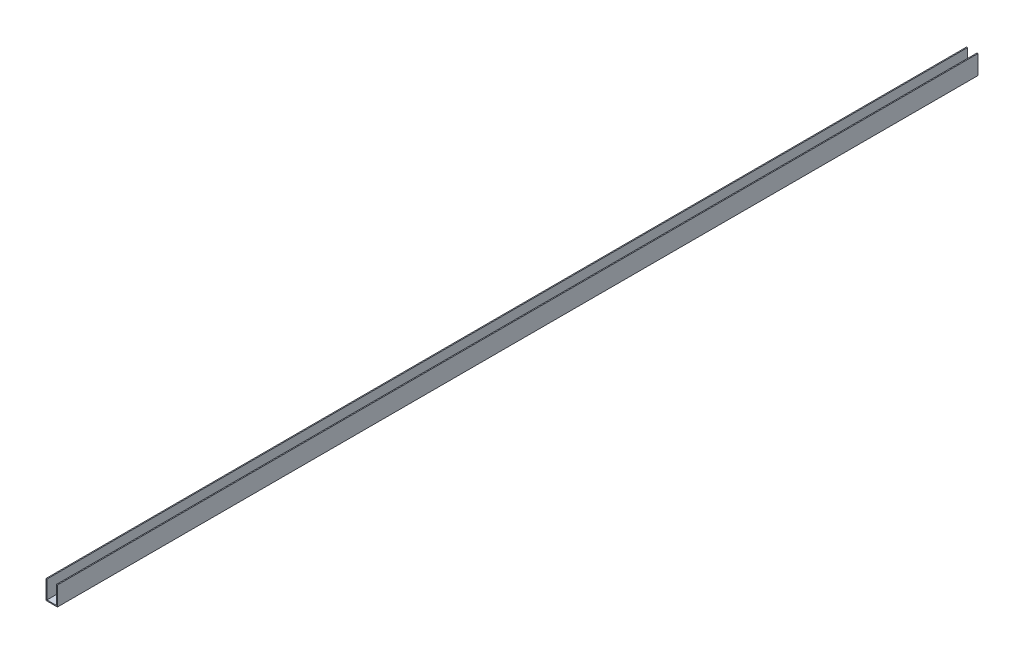
ISO-10303-21;
HEADER;
FILE_DESCRIPTION(('STEP AP214'),'2;1');
FILE_NAME('part.step','',(''),(''),'','','');
FILE_SCHEMA(('AUTOMOTIVE_DESIGN { 1 0 10303 214 1 1 1 1 }'));
ENDSEC;
DATA;
#1=APPLICATION_CONTEXT('core data for automotive mechanical design processes');
#2=APPLICATION_PROTOCOL_DEFINITION('international standard','automotive_design',2000,#1);
#3=PRODUCT_CONTEXT('',#1,'mechanical');
#4=PRODUCT('Part','Part','',(#3));
#5=PRODUCT_RELATED_PRODUCT_CATEGORY('part','',(#4));
#6=PRODUCT_DEFINITION_FORMATION('','',#4);
#7=PRODUCT_DEFINITION_CONTEXT('part definition',#1,'design');
#8=PRODUCT_DEFINITION('design','',#6,#7);
#9=PRODUCT_DEFINITION_SHAPE('','',#8);
#10=(LENGTH_UNIT() NAMED_UNIT(*) SI_UNIT(.MILLI.,.METRE.));
#11=(NAMED_UNIT(*) PLANE_ANGLE_UNIT() SI_UNIT($,.RADIAN.));
#12=(NAMED_UNIT(*) SI_UNIT($,.STERADIAN.) SOLID_ANGLE_UNIT());
#13=UNCERTAINTY_MEASURE_WITH_UNIT(LENGTH_MEASURE(1.E-05),#10,'distance_accuracy_value','');
#14=(GEOMETRIC_REPRESENTATION_CONTEXT(3) GLOBAL_UNCERTAINTY_ASSIGNED_CONTEXT((#13)) GLOBAL_UNIT_ASSIGNED_CONTEXT((#10,
#11,#12)) REPRESENTATION_CONTEXT('',''));
#15=CARTESIAN_POINT('',(0.,0.,0.));
#16=DIRECTION('',(0.,0.,1.));
#17=DIRECTION('',(1.,0.,0.));
#18=AXIS2_PLACEMENT_3D('',#15,#16,#17);
#19=CARTESIAN_POINT('',(-2.61,-5.025,511.));
#20=DIRECTION('',(-1.,0.,0.));
#21=DIRECTION('',(0.,0.,1.));
#22=AXIS2_PLACEMENT_3D('',#19,#20,#21);
#23=PLANE('',#22);
#24=DIRECTION('',(0.,1.,0.));
#25=VECTOR('',#24,1.);
#26=CARTESIAN_POINT('',(-2.61,-5.025,0.));
#27=LINE('',#26,#25);
#28=CARTESIAN_POINT('',(-2.61,-5.025,0.));
#29=VERTEX_POINT('',#28);
#30=CARTESIAN_POINT('',(-2.61,5.025,0.));
#31=VERTEX_POINT('',#30);
#32=EDGE_CURVE('E130',#29,#31,#27,.T.);
#33=ORIENTED_EDGE('',*,*,#32,.T.);
#34=DIRECTION('',(0.,0.,-1.));
#35=VECTOR('',#34,1.);
#36=CARTESIAN_POINT('',(-2.61,5.025,511.));
#37=LINE('',#36,#35);
#38=CARTESIAN_POINT('',(-2.61,5.025,511.));
#39=VERTEX_POINT('',#38);
#40=EDGE_CURVE('E11',#39,#31,#37,.T.);
#41=ORIENTED_EDGE('',*,*,#40,.F.);
#42=DIRECTION('',(0.,1.,0.));
#43=VECTOR('',#42,1.);
#44=CARTESIAN_POINT('',(-2.61,-5.025,511.));
#45=LINE('',#44,#43);
#46=CARTESIAN_POINT('',(-2.61,-5.025,511.));
#47=VERTEX_POINT('',#46);
#48=EDGE_CURVE('E144',#47,#39,#45,.T.);
#49=ORIENTED_EDGE('',*,*,#48,.F.);
#50=DIRECTION('',(0.,0.,-1.));
#51=VECTOR('',#50,1.);
#52=CARTESIAN_POINT('',(-2.61,-5.025,511.));
#53=LINE('',#52,#51);
#54=EDGE_CURVE('E126',#47,#29,#53,.T.);
#55=ORIENTED_EDGE('',*,*,#54,.T.);
#56=EDGE_LOOP('',(#33,#41,#49,#55));
#57=FACE_BOUND('',#56,.T.);
#58=ADVANCED_FACE('F34',(#57),#23,.F.);
#59=CARTESIAN_POINT('',(-2.61,5.025,511.));
#60=DIRECTION('',(0.,-1.,0.));
#61=DIRECTION('',(1.,0.,0.));
#62=AXIS2_PLACEMENT_3D('',#59,#60,#61);
#63=PLANE('',#62);
#64=DIRECTION('',(-1.,0.,0.));
#65=VECTOR('',#64,1.);
#66=CARTESIAN_POINT('',(-2.61,5.025,0.));
#67=LINE('',#66,#65);
#68=CARTESIAN_POINT('',(-3.16,5.025,0.));
#69=VERTEX_POINT('',#68);
#70=EDGE_CURVE('E133',#31,#69,#67,.T.);
#71=ORIENTED_EDGE('',*,*,#70,.T.);
#72=DIRECTION('',(0.,0.,-1.));
#73=VECTOR('',#72,1.);
#74=CARTESIAN_POINT('',(-3.16,5.025,511.));
#75=LINE('',#74,#73);
#76=CARTESIAN_POINT('',(-3.16,5.025,511.));
#77=VERTEX_POINT('',#76);
#78=EDGE_CURVE('E42',#77,#69,#75,.T.);
#79=ORIENTED_EDGE('',*,*,#78,.F.);
#80=DIRECTION('',(-1.,0.,0.));
#81=VECTOR('',#80,1.);
#82=CARTESIAN_POINT('',(-2.61,5.025,511.));
#83=LINE('',#82,#81);
#84=EDGE_CURVE('E93',#39,#77,#83,.T.);
#85=ORIENTED_EDGE('',*,*,#84,.F.);
#86=ORIENTED_EDGE('',*,*,#40,.T.);
#87=EDGE_LOOP('',(#71,#79,#85,#86));
#88=FACE_BOUND('',#87,.T.);
#89=ADVANCED_FACE('F179',(#88),#63,.F.);
#90=CARTESIAN_POINT('',(-3.16,5.025,511.));
#91=DIRECTION('',(1.,0.,0.));
#92=DIRECTION('',(0.,1.,0.));
#93=AXIS2_PLACEMENT_3D('',#90,#91,#92);
#94=PLANE('',#93);
#95=DIRECTION('',(0.,-1.,0.));
#96=VECTOR('',#95,1.);
#97=CARTESIAN_POINT('',(-3.16,5.025,0.));
#98=LINE('',#97,#96);
#99=CARTESIAN_POINT('',(-3.16,-5.575,0.));
#100=VERTEX_POINT('',#99);
#101=EDGE_CURVE('E135',#69,#100,#98,.T.);
#102=ORIENTED_EDGE('',*,*,#101,.T.);
#103=DIRECTION('',(0.,0.,-1.));
#104=VECTOR('',#103,1.);
#105=CARTESIAN_POINT('',(-3.16,-5.575,511.));
#106=LINE('',#105,#104);
#107=CARTESIAN_POINT('',(-3.16,-5.575,511.));
#108=VERTEX_POINT('',#107);
#109=EDGE_CURVE('E151',#108,#100,#106,.T.);
#110=ORIENTED_EDGE('',*,*,#109,.F.);
#111=DIRECTION('',(0.,-1.,0.));
#112=VECTOR('',#111,1.);
#113=CARTESIAN_POINT('',(-3.16,5.025,511.));
#114=LINE('',#113,#112);
#115=EDGE_CURVE('E159',#77,#108,#114,.T.);
#116=ORIENTED_EDGE('',*,*,#115,.F.);
#117=ORIENTED_EDGE('',*,*,#78,.T.);
#118=EDGE_LOOP('',(#102,#110,#116,#117));
#119=FACE_BOUND('',#118,.T.);
#120=ADVANCED_FACE('F157',(#119),#94,.F.);
#121=CARTESIAN_POINT('',(-3.16,-5.575,511.));
#122=DIRECTION('',(0.,1.,0.));
#123=DIRECTION('',(0.,0.,1.));
#124=AXIS2_PLACEMENT_3D('',#121,#122,#123);
#125=PLANE('',#124);
#126=DIRECTION('',(1.,0.,0.));
#127=VECTOR('',#126,1.);
#128=CARTESIAN_POINT('',(-3.16,-5.575,0.));
#129=LINE('',#128,#127);
#130=CARTESIAN_POINT('',(3.16,-5.575,0.));
#131=VERTEX_POINT('',#130);
#132=EDGE_CURVE('E137',#100,#131,#129,.T.);
#133=ORIENTED_EDGE('',*,*,#132,.T.);
#134=DIRECTION('',(0.,0.,-1.));
#135=VECTOR('',#134,1.);
#136=CARTESIAN_POINT('',(3.16,-5.575,511.));
#137=LINE('',#136,#135);
#138=CARTESIAN_POINT('',(3.16,-5.575,511.));
#139=VERTEX_POINT('',#138);
#140=EDGE_CURVE('E148',#139,#131,#137,.T.);
#141=ORIENTED_EDGE('',*,*,#140,.F.);
#142=DIRECTION('',(1.,0.,0.));
#143=VECTOR('',#142,1.);
#144=CARTESIAN_POINT('',(-3.16,-5.575,511.));
#145=LINE('',#144,#143);
#146=EDGE_CURVE('E171',#108,#139,#145,.T.);
#147=ORIENTED_EDGE('',*,*,#146,.F.);
#148=ORIENTED_EDGE('',*,*,#109,.T.);
#149=EDGE_LOOP('',(#133,#141,#147,#148));
#150=FACE_BOUND('',#149,.T.);
#151=ADVANCED_FACE('F167',(#150),#125,.F.);
#152=CARTESIAN_POINT('',(3.16,-5.575,511.));
#153=DIRECTION('',(-1.,0.,0.));
#154=DIRECTION('',(0.,0.,1.));
#155=AXIS2_PLACEMENT_3D('',#152,#153,#154);
#156=PLANE('',#155);
#157=DIRECTION('',(0.,1.,0.));
#158=VECTOR('',#157,1.);
#159=CARTESIAN_POINT('',(3.16,-5.575,0.));
#160=LINE('',#159,#158);
#161=CARTESIAN_POINT('',(3.16,5.025,0.));
#162=VERTEX_POINT('',#161);
#163=EDGE_CURVE('E139',#131,#162,#160,.T.);
#164=ORIENTED_EDGE('',*,*,#163,.T.);
#165=DIRECTION('',(0.,0.,-1.));
#166=VECTOR('',#165,1.);
#167=CARTESIAN_POINT('',(3.16,5.025,511.));
#168=LINE('',#167,#166);
#169=CARTESIAN_POINT('',(3.16,5.025,511.));
#170=VERTEX_POINT('',#169);
#171=EDGE_CURVE('E121',#170,#162,#168,.T.);
#172=ORIENTED_EDGE('',*,*,#171,.F.);
#173=DIRECTION('',(0.,1.,0.));
#174=VECTOR('',#173,1.);
#175=CARTESIAN_POINT('',(3.16,-5.575,511.));
#176=LINE('',#175,#174);
#177=EDGE_CURVE('E112',#139,#170,#176,.T.);
#178=ORIENTED_EDGE('',*,*,#177,.F.);
#179=ORIENTED_EDGE('',*,*,#140,.T.);
#180=EDGE_LOOP('',(#164,#172,#178,#179));
#181=FACE_BOUND('',#180,.T.);
#182=ADVANCED_FACE('F170',(#181),#156,.F.);
#183=CARTESIAN_POINT('',(3.16,5.025,511.));
#184=DIRECTION('',(0.,-1.,0.));
#185=DIRECTION('',(0.,0.,-1.));
#186=AXIS2_PLACEMENT_3D('',#183,#184,#185);
#187=PLANE('',#186);
#188=DIRECTION('',(-1.,0.,0.));
#189=VECTOR('',#188,1.);
#190=CARTESIAN_POINT('',(3.16,5.025,0.));
#191=LINE('',#190,#189);
#192=CARTESIAN_POINT('',(2.61,5.025,0.));
#193=VERTEX_POINT('',#192);
#194=EDGE_CURVE('E120',#162,#193,#191,.T.);
#195=ORIENTED_EDGE('',*,*,#194,.T.);
#196=DIRECTION('',(0.,0.,-1.));
#197=VECTOR('',#196,1.);
#198=CARTESIAN_POINT('',(2.61,5.025,511.));
#199=LINE('',#198,#197);
#200=CARTESIAN_POINT('',(2.61,5.025,511.));
#201=VERTEX_POINT('',#200);
#202=EDGE_CURVE('E117',#201,#193,#199,.T.);
#203=ORIENTED_EDGE('',*,*,#202,.F.);
#204=DIRECTION('',(-1.,0.,0.));
#205=VECTOR('',#204,1.);
#206=CARTESIAN_POINT('',(3.16,5.025,511.));
#207=LINE('',#206,#205);
#208=EDGE_CURVE('E106',#170,#201,#207,.T.);
#209=ORIENTED_EDGE('',*,*,#208,.F.);
#210=ORIENTED_EDGE('',*,*,#171,.T.);
#211=EDGE_LOOP('',(#195,#203,#209,#210));
#212=FACE_BOUND('',#211,.T.);
#213=ADVANCED_FACE('F118',(#212),#187,.F.);
#214=CARTESIAN_POINT('',(2.61,-5.025,511.));
#215=DIRECTION('',(1.,0.,0.));
#216=DIRECTION('',(0.,0.,-1.));
#217=AXIS2_PLACEMENT_3D('',#214,#215,#216);
#218=PLANE('',#217);
#219=DIRECTION('',(0.,-1.,0.));
#220=VECTOR('',#219,1.);
#221=CARTESIAN_POINT('',(2.61,-5.025,0.));
#222=LINE('',#221,#220);
#223=CARTESIAN_POINT('',(2.61,-5.025,0.));
#224=VERTEX_POINT('',#223);
#225=EDGE_CURVE('E79',#193,#224,#222,.T.);
#226=ORIENTED_EDGE('',*,*,#225,.T.);
#227=DIRECTION('',(0.,0.,-1.));
#228=VECTOR('',#227,1.);
#229=CARTESIAN_POINT('',(2.61,-5.025,511.));
#230=LINE('',#229,#228);
#231=CARTESIAN_POINT('',(2.61,-5.025,511.));
#232=VERTEX_POINT('',#231);
#233=EDGE_CURVE('E122',#232,#224,#230,.T.);
#234=ORIENTED_EDGE('',*,*,#233,.F.);
#235=DIRECTION('',(0.,-1.,0.));
#236=VECTOR('',#235,1.);
#237=CARTESIAN_POINT('',(2.61,-5.025,511.));
#238=LINE('',#237,#236);
#239=EDGE_CURVE('E110',#201,#232,#238,.T.);
#240=ORIENTED_EDGE('',*,*,#239,.F.);
#241=ORIENTED_EDGE('',*,*,#202,.T.);
#242=EDGE_LOOP('',(#226,#234,#240,#241));
#243=FACE_BOUND('',#242,.T.);
#244=ADVANCED_FACE('F124',(#243),#218,.F.);
#245=CARTESIAN_POINT('',(2.61,-5.025,511.));
#246=DIRECTION('',(0.,-1.,0.));
#247=DIRECTION('',(1.,0.,0.));
#248=AXIS2_PLACEMENT_3D('',#245,#246,#247);
#249=PLANE('',#248);
#250=DIRECTION('',(-1.,0.,0.));
#251=VECTOR('',#250,1.);
#252=CARTESIAN_POINT('',(2.61,-5.025,0.));
#253=LINE('',#252,#251);
#254=EDGE_CURVE('E85',#224,#29,#253,.T.);
#255=ORIENTED_EDGE('',*,*,#254,.T.);
#256=ORIENTED_EDGE('',*,*,#54,.F.);
#257=DIRECTION('',(-1.,0.,0.));
#258=VECTOR('',#257,1.);
#259=CARTESIAN_POINT('',(2.61,-5.025,511.));
#260=LINE('',#259,#258);
#261=EDGE_CURVE('E50',#232,#47,#260,.T.);
#262=ORIENTED_EDGE('',*,*,#261,.F.);
#263=ORIENTED_EDGE('',*,*,#233,.T.);
#264=EDGE_LOOP('',(#255,#256,#262,#263));
#265=FACE_BOUND('',#264,.T.);
#266=ADVANCED_FACE('F195',(#265),#249,.F.);
#267=CARTESIAN_POINT('',(0.,0.,511.));
#268=DIRECTION('',(0.,0.,1.));
#269=DIRECTION('',(1.,0.,0.));
#270=AXIS2_PLACEMENT_3D('',#267,#268,#269);
#271=PLANE('',#270);
#272=ORIENTED_EDGE('',*,*,#48,.T.);
#273=ORIENTED_EDGE('',*,*,#84,.T.);
#274=ORIENTED_EDGE('',*,*,#115,.T.);
#275=ORIENTED_EDGE('',*,*,#146,.T.);
#276=ORIENTED_EDGE('',*,*,#177,.T.);
#277=ORIENTED_EDGE('',*,*,#208,.T.);
#278=ORIENTED_EDGE('',*,*,#239,.T.);
#279=ORIENTED_EDGE('',*,*,#261,.T.);
#280=EDGE_LOOP('',(#272,#273,#274,#275,#276,#277,#278,#279));
#281=FACE_BOUND('',#280,.T.);
#282=ADVANCED_FACE('F108',(#281),#271,.T.);
#283=CARTESIAN_POINT('',(0.,0.,0.));
#284=DIRECTION('',(0.,0.,1.));
#285=DIRECTION('',(1.,0.,0.));
#286=AXIS2_PLACEMENT_3D('',#283,#284,#285);
#287=PLANE('',#286);
#288=ORIENTED_EDGE('',*,*,#32,.F.);
#289=ORIENTED_EDGE('',*,*,#254,.F.);
#290=ORIENTED_EDGE('',*,*,#225,.F.);
#291=ORIENTED_EDGE('',*,*,#194,.F.);
#292=ORIENTED_EDGE('',*,*,#163,.F.);
#293=ORIENTED_EDGE('',*,*,#132,.F.);
#294=ORIENTED_EDGE('',*,*,#101,.F.);
#295=ORIENTED_EDGE('',*,*,#70,.F.);
#296=EDGE_LOOP('',(#288,#289,#290,#291,#292,#293,#294,#295));
#297=FACE_BOUND('',#296,.T.);
#298=ADVANCED_FACE('F163',(#297),#287,.F.);
#299=CLOSED_SHELL('',(#58,#89,#120,#151,#182,#213,#244,#266,#282,#298));
#300=MANIFOLD_SOLID_BREP('B2',#299);
#301=ADVANCED_BREP_SHAPE_REPRESENTATION('',(#18,#300),#14);
#302=SHAPE_DEFINITION_REPRESENTATION(#9,#301);
ENDSEC;
END-ISO-10303-21;
